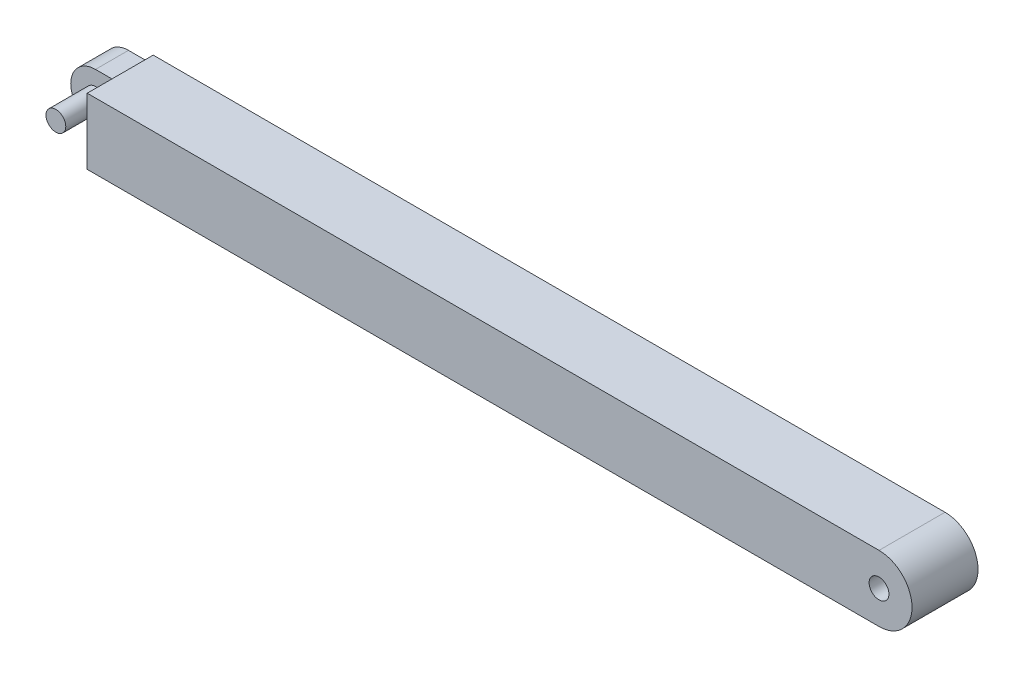
ISO-10303-21;
HEADER;
FILE_DESCRIPTION(('STEP AP214'),'2;1');
FILE_NAME('part.step','',(''),(''),'','','');
FILE_SCHEMA(('AUTOMOTIVE_DESIGN { 1 0 10303 214 1 1 1 1 }'));
ENDSEC;
DATA;
#1=APPLICATION_CONTEXT('core data for automotive mechanical design processes');
#2=APPLICATION_PROTOCOL_DEFINITION('international standard','automotive_design',2000,#1);
#3=PRODUCT_CONTEXT('',#1,'mechanical');
#4=PRODUCT('Part','Part','',(#3));
#5=PRODUCT_RELATED_PRODUCT_CATEGORY('part','',(#4));
#6=PRODUCT_DEFINITION_FORMATION('','',#4);
#7=PRODUCT_DEFINITION_CONTEXT('part definition',#1,'design');
#8=PRODUCT_DEFINITION('design','',#6,#7);
#9=PRODUCT_DEFINITION_SHAPE('','',#8);
#10=(LENGTH_UNIT() NAMED_UNIT(*) SI_UNIT(.MILLI.,.METRE.));
#11=(NAMED_UNIT(*) PLANE_ANGLE_UNIT() SI_UNIT($,.RADIAN.));
#12=(NAMED_UNIT(*) SI_UNIT($,.STERADIAN.) SOLID_ANGLE_UNIT());
#13=UNCERTAINTY_MEASURE_WITH_UNIT(LENGTH_MEASURE(1.E-05),#10,'distance_accuracy_value','');
#14=(GEOMETRIC_REPRESENTATION_CONTEXT(3) GLOBAL_UNCERTAINTY_ASSIGNED_CONTEXT((#13)) GLOBAL_UNIT_ASSIGNED_CONTEXT((#10,
#11,#12)) REPRESENTATION_CONTEXT('',''));
#15=CARTESIAN_POINT('',(0.,0.,0.));
#16=DIRECTION('',(0.,0.,1.));
#17=DIRECTION('',(1.,0.,0.));
#18=AXIS2_PLACEMENT_3D('',#15,#16,#17);
#19=CARTESIAN_POINT('',(-3.175,-3.70416666666667,0.));
#20=DIRECTION('',(0.,1.,0.));
#21=DIRECTION('',(0.,0.,1.));
#22=AXIS2_PLACEMENT_3D('',#19,#20,#21);
#23=PLANE('',#22);
#24=DIRECTION('',(0.,0.,1.));
#25=VECTOR('',#24,1.);
#26=CARTESIAN_POINT('',(-1.5875,-3.70416666666667,-73.1586567644594));
#27=LINE('',#26,#25);
#28=CARTESIAN_POINT('',(-1.5875,-3.70416666666667,0.));
#29=VERTEX_POINT('',#28);
#30=CARTESIAN_POINT('',(-1.5875,-3.70416666666667,2.11666666666667));
#31=VERTEX_POINT('',#30);
#32=EDGE_CURVE('E52',#29,#31,#27,.T.);
#33=ORIENTED_EDGE('',*,*,#32,.F.);
#34=DIRECTION('',(1.,0.,0.));
#35=VECTOR('',#34,1.);
#36=CARTESIAN_POINT('',(-3.175,-3.70416666666667,0.));
#37=LINE('',#36,#35);
#38=CARTESIAN_POINT('',(0.,-3.70416666666667,0.));
#39=VERTEX_POINT('',#38);
#40=EDGE_CURVE('E134',#29,#39,#37,.T.);
#41=ORIENTED_EDGE('',*,*,#40,.T.);
#42=DIRECTION('',(0.,0.,1.));
#43=VECTOR('',#42,1.);
#44=CARTESIAN_POINT('',(0.,-3.70416666666667,0.));
#45=LINE('',#44,#43);
#46=CARTESIAN_POINT('',(0.,-3.70416666666667,2.11666666666667));
#47=VERTEX_POINT('',#46);
#48=EDGE_CURVE('E105',#39,#47,#45,.T.);
#49=ORIENTED_EDGE('',*,*,#48,.T.);
#50=DIRECTION('',(1.,0.,0.));
#51=VECTOR('',#50,1.);
#52=CARTESIAN_POINT('',(-3.175,-3.70416666666667,2.11666666666667));
#53=LINE('',#52,#51);
#54=EDGE_CURVE('E116',#31,#47,#53,.T.);
#55=ORIENTED_EDGE('',*,*,#54,.F.);
#56=EDGE_LOOP('',(#33,#41,#49,#55));
#57=FACE_BOUND('',#56,.T.);
#58=ADVANCED_FACE('F37',(#57),#23,.F.);
#59=CARTESIAN_POINT('',(-3.175,-0.529166666666666,2.11666666666667));
#60=DIRECTION('',(0.,0.,-1.));
#61=DIRECTION('',(0.,1.,0.));
#62=AXIS2_PLACEMENT_3D('',#59,#60,#61);
#63=PLANE('',#62);
#64=CARTESIAN_POINT('',(-1.5875,-2.11666666666667,2.11666666666667));
#65=DIRECTION('',(0.,0.,-1.));
#66=DIRECTION('',(0.,1.,0.));
#67=AXIS2_PLACEMENT_3D('',#64,#65,#66);
#68=CIRCLE('',#67,0.635);
#69=CARTESIAN_POINT('',(-1.5875,-1.48166666666667,2.11666666666667));
#70=VERTEX_POINT('',#69);
#71=EDGE_CURVE('E11',#70,#70,#68,.F.);
#72=ORIENTED_EDGE('',*,*,#71,.F.);
#73=EDGE_LOOP('',(#72));
#74=FACE_BOUND('',#73,.T.);
#75=CARTESIAN_POINT('',(-1.5875,-2.11666666666667,2.11666666666667));
#76=DIRECTION('',(0.,0.,-1.));
#77=DIRECTION('',(0.,1.,0.));
#78=AXIS2_PLACEMENT_3D('',#75,#76,#77);
#79=CIRCLE('',#78,1.5875);
#80=CARTESIAN_POINT('',(-1.5875,-0.529166666666667,2.11666666666667));
#81=VERTEX_POINT('',#80);
#82=EDGE_CURVE('E60',#31,#81,#79,.T.);
#83=ORIENTED_EDGE('',*,*,#82,.F.);
#84=ORIENTED_EDGE('',*,*,#54,.T.);
#85=DIRECTION('',(0.,1.,0.));
#86=VECTOR('',#85,1.);
#87=CARTESIAN_POINT('',(0.,-0.529166666666666,2.11666666666667));
#88=LINE('',#87,#86);
#89=CARTESIAN_POINT('',(0.,-0.529166666666666,2.11666666666667));
#90=VERTEX_POINT('',#89);
#91=EDGE_CURVE('E112',#47,#90,#88,.T.);
#92=ORIENTED_EDGE('',*,*,#91,.T.);
#93=DIRECTION('',(1.,0.,0.));
#94=VECTOR('',#93,1.);
#95=CARTESIAN_POINT('',(-3.175,-0.529166666666666,2.11666666666667));
#96=LINE('',#95,#94);
#97=EDGE_CURVE('E109',#81,#90,#96,.T.);
#98=ORIENTED_EDGE('',*,*,#97,.F.);
#99=EDGE_LOOP('',(#83,#84,#92,#98));
#100=FACE_BOUND('',#99,.T.);
#101=ADVANCED_FACE('F110',(#74,#100),#63,.F.);
#102=CARTESIAN_POINT('',(0.,0.,4.23333333333333));
#103=DIRECTION('',(1.,0.,0.));
#104=DIRECTION('',(0.,0.,-1.));
#105=AXIS2_PLACEMENT_3D('',#102,#103,#104);
#106=PLANE('',#105);
#107=DIRECTION('',(0.,0.,-1.));
#108=VECTOR('',#107,1.);
#109=CARTESIAN_POINT('',(0.,-0.529166666666667,0.));
#110=LINE('',#109,#108);
#111=CARTESIAN_POINT('',(0.,-0.529166666666666,0.));
#112=VERTEX_POINT('',#111);
#113=EDGE_CURVE('E130',#90,#112,#110,.T.);
#114=ORIENTED_EDGE('',*,*,#113,.F.);
#115=ORIENTED_EDGE('',*,*,#91,.F.);
#116=ORIENTED_EDGE('',*,*,#48,.F.);
#117=DIRECTION('',(0.,-1.,0.));
#118=VECTOR('',#117,1.);
#119=CARTESIAN_POINT('',(0.,0.,0.));
#120=LINE('',#119,#118);
#121=CARTESIAN_POINT('',(0.,-4.23333333333333,0.));
#122=VERTEX_POINT('',#121);
#123=EDGE_CURVE('E136',#39,#122,#120,.T.);
#124=ORIENTED_EDGE('',*,*,#123,.T.);
#125=DIRECTION('',(0.,0.,-1.));
#126=VECTOR('',#125,1.);
#127=CARTESIAN_POINT('',(0.,-4.23333333333333,4.23333333333333));
#128=LINE('',#127,#126);
#129=CARTESIAN_POINT('',(0.,-4.23333333333333,4.23333333333333));
#130=VERTEX_POINT('',#129);
#131=EDGE_CURVE('E45',#130,#122,#128,.T.);
#132=ORIENTED_EDGE('',*,*,#131,.F.);
#133=DIRECTION('',(0.,-1.,0.));
#134=VECTOR('',#133,1.);
#135=CARTESIAN_POINT('',(0.,0.,4.23333333333333));
#136=LINE('',#135,#134);
#137=CARTESIAN_POINT('',(0.,0.,4.23333333333333));
#138=VERTEX_POINT('',#137);
#139=EDGE_CURVE('E137',#138,#130,#136,.T.);
#140=ORIENTED_EDGE('',*,*,#139,.F.);
#141=DIRECTION('',(0.,0.,-1.));
#142=VECTOR('',#141,1.);
#143=CARTESIAN_POINT('',(0.,0.,4.23333333333333));
#144=LINE('',#143,#142);
#145=CARTESIAN_POINT('',(0.,0.,0.));
#146=VERTEX_POINT('',#145);
#147=EDGE_CURVE('E147',#138,#146,#144,.T.);
#148=ORIENTED_EDGE('',*,*,#147,.T.);
#149=EDGE_CURVE('E148',#146,#112,#120,.T.);
#150=ORIENTED_EDGE('',*,*,#149,.T.);
#151=EDGE_LOOP('',(#114,#115,#116,#124,#132,#140,#148,#150));
#152=FACE_BOUND('',#151,.T.);
#153=ADVANCED_FACE('F39',(#152),#106,.F.);
#154=CARTESIAN_POINT('',(0.,-4.23333333333333,4.23333333333333));
#155=DIRECTION('',(0.,1.,0.));
#156=DIRECTION('',(0.,0.,1.));
#157=AXIS2_PLACEMENT_3D('',#154,#155,#156);
#158=PLANE('',#157);
#159=DIRECTION('',(1.,0.,0.));
#160=VECTOR('',#159,1.);
#161=CARTESIAN_POINT('',(0.,-4.23333333333333,0.));
#162=LINE('',#161,#160);
#163=CARTESIAN_POINT('',(50.8,-4.23333333333333,0.));
#164=VERTEX_POINT('',#163);
#165=EDGE_CURVE('E151',#122,#164,#162,.T.);
#166=ORIENTED_EDGE('',*,*,#165,.T.);
#167=DIRECTION('',(0.,0.,-1.));
#168=VECTOR('',#167,1.);
#169=CARTESIAN_POINT('',(50.8,-4.23333333333333,4.23333333333333));
#170=LINE('',#169,#168);
#171=CARTESIAN_POINT('',(50.8,-4.23333333333333,4.23333333333333));
#172=VERTEX_POINT('',#171);
#173=EDGE_CURVE('E161',#172,#164,#170,.T.);
#174=ORIENTED_EDGE('',*,*,#173,.F.);
#175=DIRECTION('',(1.,0.,0.));
#176=VECTOR('',#175,1.);
#177=CARTESIAN_POINT('',(0.,-4.23333333333333,4.23333333333333));
#178=LINE('',#177,#176);
#179=EDGE_CURVE('E140',#130,#172,#178,.T.);
#180=ORIENTED_EDGE('',*,*,#179,.F.);
#181=ORIENTED_EDGE('',*,*,#131,.T.);
#182=EDGE_LOOP('',(#166,#174,#180,#181));
#183=FACE_BOUND('',#182,.T.);
#184=ADVANCED_FACE('F166',(#183),#158,.F.);
#185=CARTESIAN_POINT('',(50.8,-2.11666666666667,4.23333333333333));
#186=DIRECTION('',(0.,0.,-1.));
#187=DIRECTION('',(-1.,0.,0.));
#188=AXIS2_PLACEMENT_3D('',#185,#186,#187);
#189=CYLINDRICAL_SURFACE('',#188,2.11666666666667);
#190=CARTESIAN_POINT('',(50.8,-2.11666666666667,0.));
#191=DIRECTION('',(0.,0.,1.));
#192=DIRECTION('',(-1.,0.,0.));
#193=AXIS2_PLACEMENT_3D('',#190,#191,#192);
#194=CIRCLE('',#193,2.11666666666667);
#195=CARTESIAN_POINT('',(50.8,0.,0.));
#196=VERTEX_POINT('',#195);
#197=EDGE_CURVE('E153',#164,#196,#194,.T.);
#198=ORIENTED_EDGE('',*,*,#197,.T.);
#199=DIRECTION('',(0.,0.,-1.));
#200=VECTOR('',#199,1.);
#201=CARTESIAN_POINT('',(50.8,0.,4.23333333333333));
#202=LINE('',#201,#200);
#203=CARTESIAN_POINT('',(50.8,0.,4.23333333333333));
#204=VERTEX_POINT('',#203);
#205=EDGE_CURVE('E158',#204,#196,#202,.T.);
#206=ORIENTED_EDGE('',*,*,#205,.F.);
#207=CARTESIAN_POINT('',(50.8,-2.11666666666667,4.23333333333333));
#208=DIRECTION('',(0.,0.,1.));
#209=DIRECTION('',(-1.,0.,0.));
#210=AXIS2_PLACEMENT_3D('',#207,#208,#209);
#211=CIRCLE('',#210,2.11666666666667);
#212=EDGE_CURVE('E143',#172,#204,#211,.T.);
#213=ORIENTED_EDGE('',*,*,#212,.F.);
#214=ORIENTED_EDGE('',*,*,#173,.T.);
#215=EDGE_LOOP('',(#198,#206,#213,#214));
#216=FACE_BOUND('',#215,.T.);
#217=ADVANCED_FACE('F180',(#216),#189,.T.);
#218=CARTESIAN_POINT('',(0.,0.,4.23333333333333));
#219=DIRECTION('',(0.,-1.,0.));
#220=DIRECTION('',(0.,0.,-1.));
#221=AXIS2_PLACEMENT_3D('',#218,#219,#220);
#222=PLANE('',#221);
#223=DIRECTION('',(-1.,0.,0.));
#224=VECTOR('',#223,1.);
#225=CARTESIAN_POINT('',(0.,0.,0.));
#226=LINE('',#225,#224);
#227=EDGE_CURVE('E141',#196,#146,#226,.T.);
#228=ORIENTED_EDGE('',*,*,#227,.T.);
#229=ORIENTED_EDGE('',*,*,#147,.F.);
#230=DIRECTION('',(-1.,0.,0.));
#231=VECTOR('',#230,1.);
#232=CARTESIAN_POINT('',(0.,0.,4.23333333333333));
#233=LINE('',#232,#231);
#234=EDGE_CURVE('E145',#204,#138,#233,.T.);
#235=ORIENTED_EDGE('',*,*,#234,.F.);
#236=ORIENTED_EDGE('',*,*,#205,.T.);
#237=EDGE_LOOP('',(#228,#229,#235,#236));
#238=FACE_BOUND('',#237,.T.);
#239=ADVANCED_FACE('F184',(#238),#222,.F.);
#240=CARTESIAN_POINT('',(50.8,-2.11666666666667,4.23333333333333));
#241=DIRECTION('',(0.,0.,-1.));
#242=DIRECTION('',(-1.,0.,0.));
#243=AXIS2_PLACEMENT_3D('',#240,#241,#242);
#244=PLANE('',#243);
#245=CARTESIAN_POINT('',(50.8,-2.11666666666667,4.23333333333333));
#246=DIRECTION('',(0.,0.,1.));
#247=DIRECTION('',(1.,0.,0.));
#248=AXIS2_PLACEMENT_3D('',#245,#246,#247);
#249=CIRCLE('',#248,0.634999999999995);
#250=CARTESIAN_POINT('',(51.435,-2.11666666666667,4.23333333333333));
#251=VERTEX_POINT('',#250);
#252=EDGE_CURVE('E239',#251,#251,#249,.T.);
#253=ORIENTED_EDGE('',*,*,#252,.F.);
#254=EDGE_LOOP('',(#253));
#255=FACE_BOUND('',#254,.T.);
#256=ORIENTED_EDGE('',*,*,#139,.T.);
#257=ORIENTED_EDGE('',*,*,#179,.T.);
#258=ORIENTED_EDGE('',*,*,#212,.T.);
#259=ORIENTED_EDGE('',*,*,#234,.T.);
#260=EDGE_LOOP('',(#256,#257,#258,#259));
#261=FACE_BOUND('',#260,.T.);
#262=ADVANCED_FACE('F187',(#255,#261),#244,.F.);
#263=CARTESIAN_POINT('',(50.8,-2.11666666666667,0.));
#264=DIRECTION('',(0.,0.,-1.));
#265=DIRECTION('',(-1.,0.,0.));
#266=AXIS2_PLACEMENT_3D('',#263,#264,#265);
#267=PLANE('',#266);
#268=CARTESIAN_POINT('',(50.8,-2.11666666666667,0.));
#269=DIRECTION('',(0.,0.,-1.));
#270=DIRECTION('',(-1.,0.,0.));
#271=AXIS2_PLACEMENT_3D('',#268,#269,#270);
#272=CIRCLE('',#271,0.634999999999995);
#273=CARTESIAN_POINT('',(50.165,-2.11666666666667,0.));
#274=VERTEX_POINT('',#273);
#275=EDGE_CURVE('E240',#274,#274,#272,.T.);
#276=ORIENTED_EDGE('',*,*,#275,.F.);
#277=EDGE_LOOP('',(#276));
#278=FACE_BOUND('',#277,.T.);
#279=CARTESIAN_POINT('',(-1.5875,-2.11666666666667,0.));
#280=DIRECTION('',(0.,0.,-1.));
#281=DIRECTION('',(-1.,0.,0.));
#282=AXIS2_PLACEMENT_3D('',#279,#280,#281);
#283=CIRCLE('',#282,1.5875);
#284=CARTESIAN_POINT('',(-1.5875,-0.529166666666667,0.));
#285=VERTEX_POINT('',#284);
#286=EDGE_CURVE('E106',#285,#29,#283,.F.);
#287=ORIENTED_EDGE('',*,*,#286,.F.);
#288=DIRECTION('',(1.,0.,0.));
#289=VECTOR('',#288,1.);
#290=CARTESIAN_POINT('',(-3.175,-0.529166666666667,0.));
#291=LINE('',#290,#289);
#292=EDGE_CURVE('E117',#285,#112,#291,.T.);
#293=ORIENTED_EDGE('',*,*,#292,.T.);
#294=ORIENTED_EDGE('',*,*,#149,.F.);
#295=ORIENTED_EDGE('',*,*,#227,.F.);
#296=ORIENTED_EDGE('',*,*,#197,.F.);
#297=ORIENTED_EDGE('',*,*,#165,.F.);
#298=ORIENTED_EDGE('',*,*,#123,.F.);
#299=ORIENTED_EDGE('',*,*,#40,.F.);
#300=EDGE_LOOP('',(#287,#293,#294,#295,#296,#297,#298,#299));
#301=FACE_BOUND('',#300,.T.);
#302=ADVANCED_FACE('F175',(#278,#301),#267,.T.);
#303=CARTESIAN_POINT('',(-3.175,-0.529166666666667,0.));
#304=DIRECTION('',(0.,-1.,0.));
#305=DIRECTION('',(0.,0.,-1.));
#306=AXIS2_PLACEMENT_3D('',#303,#304,#305);
#307=PLANE('',#306);
#308=ORIENTED_EDGE('',*,*,#292,.F.);
#309=DIRECTION('',(0.,0.,1.));
#310=VECTOR('',#309,1.);
#311=CARTESIAN_POINT('',(-1.5875,-0.529166666666667,-73.1586567644594));
#312=LINE('',#311,#310);
#313=EDGE_CURVE('E104',#285,#81,#312,.T.);
#314=ORIENTED_EDGE('',*,*,#313,.T.);
#315=ORIENTED_EDGE('',*,*,#97,.T.);
#316=ORIENTED_EDGE('',*,*,#113,.T.);
#317=EDGE_LOOP('',(#308,#314,#315,#316));
#318=FACE_BOUND('',#317,.T.);
#319=ADVANCED_FACE('F120',(#318),#307,.F.);
#320=CARTESIAN_POINT('',(-1.5875,-2.11666666666667,-73.1586567644594));
#321=DIRECTION('',(0.,0.,1.));
#322=DIRECTION('',(1.,0.,0.));
#323=AXIS2_PLACEMENT_3D('',#320,#321,#322);
#324=CYLINDRICAL_SURFACE('',#323,1.5875);
#325=ORIENTED_EDGE('',*,*,#32,.T.);
#326=ORIENTED_EDGE('',*,*,#82,.T.);
#327=ORIENTED_EDGE('',*,*,#313,.F.);
#328=ORIENTED_EDGE('',*,*,#286,.T.);
#329=EDGE_LOOP('',(#325,#326,#327,#328));
#330=FACE_BOUND('',#329,.T.);
#331=ADVANCED_FACE('F101',(#330),#324,.T.);
#332=CARTESIAN_POINT('',(-1.5875,-2.11666666666667,4.65666666666667));
#333=DIRECTION('',(0.,0.,-1.));
#334=DIRECTION('',(-1.,0.,0.));
#335=AXIS2_PLACEMENT_3D('',#332,#333,#334);
#336=CYLINDRICAL_SURFACE('',#335,0.635);
#337=CARTESIAN_POINT('',(-1.5875,-2.11666666666667,4.65666666666667));
#338=DIRECTION('',(0.,0.,1.));
#339=DIRECTION('',(1.,0.,0.));
#340=AXIS2_PLACEMENT_3D('',#337,#338,#339);
#341=CIRCLE('',#340,0.635);
#342=CARTESIAN_POINT('',(-0.9525,-2.11666666666667,4.65666666666667));
#343=VERTEX_POINT('',#342);
#344=EDGE_CURVE('E123',#343,#343,#341,.T.);
#345=ORIENTED_EDGE('',*,*,#344,.F.);
#346=EDGE_LOOP('',(#345));
#347=FACE_BOUND('',#346,.T.);
#348=ORIENTED_EDGE('',*,*,#71,.T.);
#349=EDGE_LOOP('',(#348));
#350=FACE_BOUND('',#349,.T.);
#351=ADVANCED_FACE('F211',(#347,#350),#336,.T.);
#352=CARTESIAN_POINT('',(-1.5875,-2.11666666666667,4.65666666666667));
#353=DIRECTION('',(0.,0.,1.));
#354=DIRECTION('',(1.,0.,0.));
#355=AXIS2_PLACEMENT_3D('',#352,#353,#354);
#356=PLANE('',#355);
#357=ORIENTED_EDGE('',*,*,#344,.T.);
#358=EDGE_LOOP('',(#357));
#359=FACE_BOUND('',#358,.T.);
#360=ADVANCED_FACE('F214',(#359),#356,.T.);
#361=CARTESIAN_POINT('',(50.8,-2.11666666666667,2.96333333333333));
#362=DIRECTION('',(0.,0.,1.));
#363=DIRECTION('',(1.,0.,0.));
#364=AXIS2_PLACEMENT_3D('',#361,#362,#363);
#365=CYLINDRICAL_SURFACE('',#364,0.634999999999995);
#366=CARTESIAN_POINT('',(50.8,-2.11666666666667,2.96333333333333));
#367=DIRECTION('',(0.,0.,1.));
#368=DIRECTION('',(1.,0.,0.));
#369=AXIS2_PLACEMENT_3D('',#366,#367,#368);
#370=CIRCLE('',#369,0.634999999999995);
#371=CARTESIAN_POINT('',(51.435,-2.11666666666667,2.96333333333333));
#372=VERTEX_POINT('',#371);
#373=EDGE_CURVE('E243',#372,#372,#370,.T.);
#374=ORIENTED_EDGE('',*,*,#373,.F.);
#375=EDGE_LOOP('',(#374));
#376=FACE_BOUND('',#375,.T.);
#377=ORIENTED_EDGE('',*,*,#252,.T.);
#378=EDGE_LOOP('',(#377));
#379=FACE_BOUND('',#378,.T.);
#380=ADVANCED_FACE('F218',(#376,#379),#365,.F.);
#381=CARTESIAN_POINT('',(50.8,-2.11666666666667,2.96333333333333));
#382=DIRECTION('',(0.,0.,1.));
#383=DIRECTION('',(1.,0.,0.));
#384=AXIS2_PLACEMENT_3D('',#381,#382,#383);
#385=PLANE('',#384);
#386=ORIENTED_EDGE('',*,*,#373,.T.);
#387=EDGE_LOOP('',(#386));
#388=FACE_BOUND('',#387,.T.);
#389=ADVANCED_FACE('F222',(#388),#385,.T.);
#390=CARTESIAN_POINT('',(50.8,-2.11666666666667,1.27));
#391=DIRECTION('',(0.,0.,-1.));
#392=DIRECTION('',(-1.,0.,0.));
#393=AXIS2_PLACEMENT_3D('',#390,#391,#392);
#394=CYLINDRICAL_SURFACE('',#393,0.634999999999995);
#395=CARTESIAN_POINT('',(50.8,-2.11666666666667,1.27));
#396=DIRECTION('',(0.,0.,-1.));
#397=DIRECTION('',(-1.,0.,0.));
#398=AXIS2_PLACEMENT_3D('',#395,#396,#397);
#399=CIRCLE('',#398,0.634999999999995);
#400=CARTESIAN_POINT('',(50.165,-2.11666666666667,1.27));
#401=VERTEX_POINT('',#400);
#402=EDGE_CURVE('E238',#401,#401,#399,.T.);
#403=ORIENTED_EDGE('',*,*,#402,.F.);
#404=EDGE_LOOP('',(#403));
#405=FACE_BOUND('',#404,.T.);
#406=ORIENTED_EDGE('',*,*,#275,.T.);
#407=EDGE_LOOP('',(#406));
#408=FACE_BOUND('',#407,.T.);
#409=ADVANCED_FACE('F226',(#405,#408),#394,.F.);
#410=CARTESIAN_POINT('',(50.8,-2.11666666666667,1.27));
#411=DIRECTION('',(0.,0.,-1.));
#412=DIRECTION('',(-1.,0.,0.));
#413=AXIS2_PLACEMENT_3D('',#410,#411,#412);
#414=PLANE('',#413);
#415=ORIENTED_EDGE('',*,*,#402,.T.);
#416=EDGE_LOOP('',(#415));
#417=FACE_BOUND('',#416,.T.);
#418=ADVANCED_FACE('F230',(#417),#414,.T.);
#419=CLOSED_SHELL('',(#58,#101,#153,#184,#217,#239,#262,#302,#319,#331,#351,#360,#380,#389,#409,#418));
#420=MANIFOLD_SOLID_BREP('B2',#419);
#421=ADVANCED_BREP_SHAPE_REPRESENTATION('',(#18,#420),#14);
#422=SHAPE_DEFINITION_REPRESENTATION(#9,#421);
ENDSEC;
END-ISO-10303-21;
